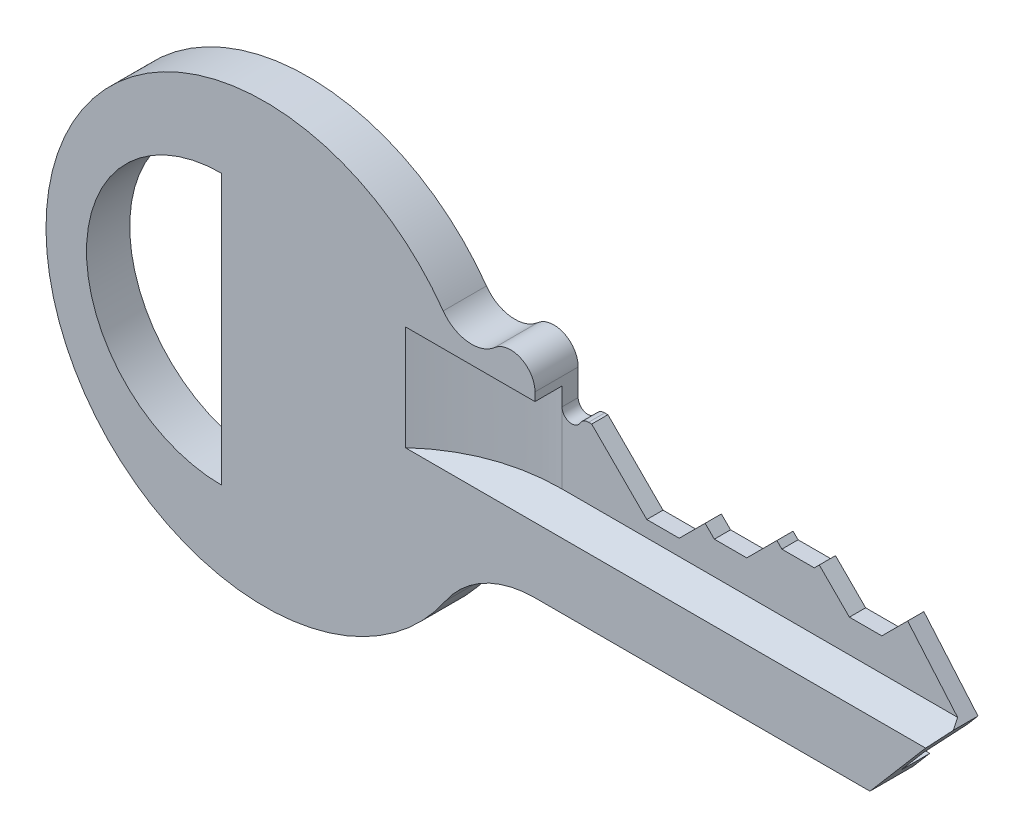
ISO-10303-21;
HEADER;
FILE_DESCRIPTION(('STEP AP214'),'2;1');
FILE_NAME('part.step','',(''),(''),'','','');
FILE_SCHEMA(('AUTOMOTIVE_DESIGN { 1 0 10303 214 1 1 1 1 }'));
ENDSEC;
DATA;
#1=APPLICATION_CONTEXT('core data for automotive mechanical design processes');
#2=APPLICATION_PROTOCOL_DEFINITION('international standard','automotive_design',2000,#1);
#3=PRODUCT_CONTEXT('',#1,'mechanical');
#4=PRODUCT('Part','Part','',(#3));
#5=PRODUCT_RELATED_PRODUCT_CATEGORY('part','',(#4));
#6=PRODUCT_DEFINITION_FORMATION('','',#4);
#7=PRODUCT_DEFINITION_CONTEXT('part definition',#1,'design');
#8=PRODUCT_DEFINITION('design','',#6,#7);
#9=PRODUCT_DEFINITION_SHAPE('','',#8);
#10=(LENGTH_UNIT() NAMED_UNIT(*) SI_UNIT(.MILLI.,.METRE.));
#11=(NAMED_UNIT(*) PLANE_ANGLE_UNIT() SI_UNIT($,.RADIAN.));
#12=(NAMED_UNIT(*) SI_UNIT($,.STERADIAN.) SOLID_ANGLE_UNIT());
#13=UNCERTAINTY_MEASURE_WITH_UNIT(LENGTH_MEASURE(1.E-05),#10,'distance_accuracy_value','');
#14=(GEOMETRIC_REPRESENTATION_CONTEXT(3) GLOBAL_UNCERTAINTY_ASSIGNED_CONTEXT((#13)) GLOBAL_UNIT_ASSIGNED_CONTEXT((#10,
#11,#12)) REPRESENTATION_CONTEXT('',''));
#15=CARTESIAN_POINT('',(0.,0.,0.));
#16=DIRECTION('',(0.,0.,1.));
#17=DIRECTION('',(1.,0.,0.));
#18=AXIS2_PLACEMENT_3D('',#15,#16,#17);
#19=CARTESIAN_POINT('',(0.,-5.07593069439131,2.032));
#20=DIRECTION('',(0.,0.,1.));
#21=DIRECTION('',(1.,0.,0.));
#22=AXIS2_PLACEMENT_3D('',#19,#20,#21);
#23=PLANE('',#22);
#24=DIRECTION('',(1.,0.,0.));
#25=VECTOR('',#24,1.);
#26=CARTESIAN_POINT('',(-6.096,3.06406515812918,2.032));
#27=LINE('',#26,#25);
#28=CARTESIAN_POINT('',(-6.096,3.06406515812918,2.032));
#29=VERTEX_POINT('',#28);
#30=CARTESIAN_POINT('',(18.3649951528505,3.06406515812918,2.032));
#31=VERTEX_POINT('',#30);
#32=EDGE_CURVE('E376',#29,#31,#27,.T.);
#33=ORIENTED_EDGE('',*,*,#32,.F.);
#34=DIRECTION('',(0.,-1.,0.));
#35=VECTOR('',#34,1.);
#36=CARTESIAN_POINT('',(-6.096,3.06406515812918,2.032));
#37=LINE('',#36,#35);
#38=CARTESIAN_POINT('',(-6.096,7.9883,2.032));
#39=VERTEX_POINT('',#38);
#40=EDGE_CURVE('E357',#39,#29,#37,.T.);
#41=ORIENTED_EDGE('',*,*,#40,.F.);
#42=DIRECTION('',(1.,0.,0.));
#43=VECTOR('',#42,1.);
#44=CARTESIAN_POINT('',(-6.096,7.9883,2.032));
#45=LINE('',#44,#43);
#46=CARTESIAN_POINT('',(0.,7.9883,2.032));
#47=VERTEX_POINT('',#46);
#48=EDGE_CURVE('E378',#39,#47,#45,.T.);
#49=ORIENTED_EDGE('',*,*,#48,.T.);
#50=DIRECTION('',(0.,1.,0.));
#51=VECTOR('',#50,1.);
#52=CARTESIAN_POINT('',(0.,7.1374,2.032));
#53=LINE('',#52,#51);
#54=CARTESIAN_POINT('',(0.,8.382,2.032));
#55=VERTEX_POINT('',#54);
#56=EDGE_CURVE('E422',#47,#55,#53,.T.);
#57=ORIENTED_EDGE('',*,*,#56,.T.);
#58=CARTESIAN_POINT('',(-1.143,8.382,2.032));
#59=DIRECTION('',(0.,0.,1.));
#60=DIRECTION('',(1.,0.,0.));
#61=AXIS2_PLACEMENT_3D('',#58,#59,#60);
#62=CIRCLE('',#61,1.143);
#63=CARTESIAN_POINT('',(-1.89643562918692,9.24152530659179,2.032));
#64=VERTEX_POINT('',#63);
#65=EDGE_CURVE('E424',#55,#64,#62,.T.);
#66=ORIENTED_EDGE('',*,*,#65,.T.);
#67=CARTESIAN_POINT('',(-2.97668145103572,10.4738782578599,2.032));
#68=DIRECTION('',(0.,0.,-1.));
#69=DIRECTION('',(-1.,0.,0.));
#70=AXIS2_PLACEMENT_3D('',#67,#68,#69);
#71=CIRCLE('',#70,1.63878761043677);
#72=CARTESIAN_POINT('',(-4.31281575711493,9.525,2.032));
#73=VERTEX_POINT('',#72);
#74=EDGE_CURVE('E426',#64,#73,#71,.T.);
#75=ORIENTED_EDGE('',*,*,#74,.T.);
#76=CARTESIAN_POINT('',(-12.6999999942675,3.5687,2.032));
#77=DIRECTION('',(0.,0.,1.));
#78=DIRECTION('',(1.,0.,0.));
#79=AXIS2_PLACEMENT_3D('',#76,#77,#78);
#80=CIRCLE('',#79,10.2870000057325);
#81=CARTESIAN_POINT('',(-4.19609520136365,-2.21973436441734,2.032));
#82=VERTEX_POINT('',#81);
#83=EDGE_CURVE('E428',#73,#82,#80,.T.);
#84=ORIENTED_EDGE('',*,*,#83,.T.);
#85=CARTESIAN_POINT('',(0.,-5.07593069439131,2.032));
#86=DIRECTION('',(0.,0.,-1.));
#87=DIRECTION('',(1.,0.,0.));
#88=AXIS2_PLACEMENT_3D('',#85,#86,#87);
#89=CIRCLE('',#88,5.07593069439131);
#90=CARTESIAN_POINT('',(0.,0.,2.032));
#91=VERTEX_POINT('',#90);
#92=EDGE_CURVE('E413',#82,#91,#89,.T.);
#93=ORIENTED_EDGE('',*,*,#92,.T.);
#94=DIRECTION('',(1.,0.,0.));
#95=VECTOR('',#94,1.);
#96=CARTESIAN_POINT('',(0.,0.,2.032));
#97=LINE('',#96,#95);
#98=CARTESIAN_POINT('',(15.748,0.,2.032));
#99=VERTEX_POINT('',#98);
#100=EDGE_CURVE('E416',#91,#99,#97,.T.);
#101=ORIENTED_EDGE('',*,*,#100,.T.);
#102=DIRECTION('',(0.649453254633193,0.760401518966363,0.));
#103=VECTOR('',#102,1.);
#104=CARTESIAN_POINT('',(15.748,0.,2.032));
#105=LINE('',#104,#103);
#106=EDGE_CURVE('E419',#99,#31,#105,.T.);
#107=ORIENTED_EDGE('',*,*,#106,.T.);
#108=EDGE_LOOP('',(#33,#41,#49,#57,#66,#75,#84,#93,#101,#107));
#109=FACE_BOUND('',#108,.T.);
#110=DIRECTION('',(0.,1.,0.));
#111=VECTOR('',#110,1.);
#112=CARTESIAN_POINT('',(-14.732,9.9187,2.032));
#113=LINE('',#112,#111);
#114=CARTESIAN_POINT('',(-14.732,-2.7813,2.032));
#115=VERTEX_POINT('',#114);
#116=CARTESIAN_POINT('',(-14.732,9.9187,2.032));
#117=VERTEX_POINT('',#116);
#118=EDGE_CURVE('E399',#115,#117,#113,.T.);
#119=ORIENTED_EDGE('',*,*,#118,.F.);
#120=CARTESIAN_POINT('',(-14.732,3.5687,2.032));
#121=DIRECTION('',(0.,0.,1.));
#122=DIRECTION('',(-1.,0.,0.));
#123=AXIS2_PLACEMENT_3D('',#120,#121,#122);
#124=CIRCLE('',#123,6.35);
#125=EDGE_CURVE('E396',#117,#115,#124,.T.);
#126=ORIENTED_EDGE('',*,*,#125,.F.);
#127=EDGE_LOOP('',(#119,#126));
#128=FACE_BOUND('',#127,.T.);
#129=ADVANCED_FACE('F36',(#109,#128),#23,.T.);
#130=CARTESIAN_POINT('',(0.,-5.07593069439131,0.));
#131=DIRECTION('',(0.,0.,1.));
#132=DIRECTION('',(1.,0.,0.));
#133=AXIS2_PLACEMENT_3D('',#130,#131,#132);
#134=PLANE('',#133);
#135=DIRECTION('',(1.,0.,0.));
#136=VECTOR('',#135,1.);
#137=CARTESIAN_POINT('',(15.0368,5.334,0.));
#138=LINE('',#137,#136);
#139=CARTESIAN_POINT('',(13.5128,5.334,0.));
#140=VERTEX_POINT('',#139);
#141=CARTESIAN_POINT('',(15.0368,5.334,0.));
#142=VERTEX_POINT('',#141);
#143=EDGE_CURVE('E302',#140,#142,#138,.T.);
#144=ORIENTED_EDGE('',*,*,#143,.T.);
#145=DIRECTION('',(0.707106781186546,0.707106781186549,0.));
#146=VECTOR('',#145,1.);
#147=CARTESIAN_POINT('',(16.2511247600768,6.54832476007678,0.));
#148=LINE('',#147,#146);
#149=CARTESIAN_POINT('',(16.2511247600768,6.54832476007678,0.));
#150=VERTEX_POINT('',#149);
#151=EDGE_CURVE('E259',#142,#150,#148,.T.);
#152=ORIENTED_EDGE('',*,*,#151,.T.);
#153=DIRECTION('',(-0.649453254633193,0.760401518966363,0.));
#154=VECTOR('',#153,1.);
#155=CARTESIAN_POINT('',(18.796,3.5687,0.));
#156=LINE('',#155,#154);
#157=CARTESIAN_POINT('',(18.796,3.5687,0.));
#158=VERTEX_POINT('',#157);
#159=EDGE_CURVE('E439',#158,#150,#156,.T.);
#160=ORIENTED_EDGE('',*,*,#159,.F.);
#161=DIRECTION('',(0.649453254633193,0.760401518966363,0.));
#162=VECTOR('',#161,1.);
#163=CARTESIAN_POINT('',(15.748,0.,0.));
#164=LINE('',#163,#162);
#165=CARTESIAN_POINT('',(18.2837676419659,2.96896128080177,0.));
#166=VERTEX_POINT('',#165);
#167=EDGE_CURVE('E435',#166,#158,#164,.T.);
#168=ORIENTED_EDGE('',*,*,#167,.F.);
#169=DIRECTION('',(1.,0.,0.));
#170=VECTOR('',#169,1.);
#171=CARTESIAN_POINT('',(-6.096,2.96896128080177,0.));
#172=LINE('',#171,#170);
#173=CARTESIAN_POINT('',(-6.096,2.96896128080177,0.));
#174=VERTEX_POINT('',#173);
#175=EDGE_CURVE('E361',#174,#166,#172,.T.);
#176=ORIENTED_EDGE('',*,*,#175,.F.);
#177=DIRECTION('',(0.,1.,0.));
#178=VECTOR('',#177,1.);
#179=CARTESIAN_POINT('',(-6.096,2.96896128080177,0.));
#180=LINE('',#179,#178);
#181=CARTESIAN_POINT('',(-6.096,0.9144,0.));
#182=VERTEX_POINT('',#181);
#183=EDGE_CURVE('E358',#182,#174,#180,.T.);
#184=ORIENTED_EDGE('',*,*,#183,.F.);
#185=DIRECTION('',(1.,0.,0.));
#186=VECTOR('',#185,1.);
#187=CARTESIAN_POINT('',(-6.096,0.9144,0.));
#188=LINE('',#187,#186);
#189=CARTESIAN_POINT('',(16.5289822064057,0.9144,0.));
#190=VERTEX_POINT('',#189);
#191=EDGE_CURVE('E363',#182,#190,#188,.T.);
#192=ORIENTED_EDGE('',*,*,#191,.T.);
#193=CARTESIAN_POINT('',(15.748,0.,0.));
#194=VERTEX_POINT('',#193);
#195=EDGE_CURVE('E436',#194,#190,#164,.T.);
#196=ORIENTED_EDGE('',*,*,#195,.F.);
#197=DIRECTION('',(1.,0.,0.));
#198=VECTOR('',#197,1.);
#199=CARTESIAN_POINT('',(0.,0.,0.));
#200=LINE('',#199,#198);
#201=CARTESIAN_POINT('',(0.,0.,0.));
#202=VERTEX_POINT('',#201);
#203=EDGE_CURVE('E433',#202,#194,#200,.T.);
#204=ORIENTED_EDGE('',*,*,#203,.F.);
#205=CARTESIAN_POINT('',(0.,-5.07593069439131,0.));
#206=DIRECTION('',(0.,0.,-1.));
#207=DIRECTION('',(1.,0.,0.));
#208=AXIS2_PLACEMENT_3D('',#205,#206,#207);
#209=CIRCLE('',#208,5.07593069439131);
#210=CARTESIAN_POINT('',(-4.19609520136365,-2.21973436441734,0.));
#211=VERTEX_POINT('',#210);
#212=EDGE_CURVE('E412',#211,#202,#209,.T.);
#213=ORIENTED_EDGE('',*,*,#212,.F.);
#214=CARTESIAN_POINT('',(-12.6999999942675,3.5687,0.));
#215=DIRECTION('',(0.,0.,1.));
#216=DIRECTION('',(1.,0.,0.));
#217=AXIS2_PLACEMENT_3D('',#214,#215,#216);
#218=CIRCLE('',#217,10.2870000057325);
#219=CARTESIAN_POINT('',(-4.31281575711493,9.525,0.));
#220=VERTEX_POINT('',#219);
#221=EDGE_CURVE('E417',#220,#211,#218,.T.);
#222=ORIENTED_EDGE('',*,*,#221,.F.);
#223=CARTESIAN_POINT('',(-2.97668145103572,10.4738782578599,0.));
#224=DIRECTION('',(0.,0.,-1.));
#225=DIRECTION('',(-1.,0.,0.));
#226=AXIS2_PLACEMENT_3D('',#223,#224,#225);
#227=CIRCLE('',#226,1.63878761043677);
#228=CARTESIAN_POINT('',(-1.89643562918692,9.24152530659179,0.));
#229=VERTEX_POINT('',#228);
#230=EDGE_CURVE('E453',#229,#220,#227,.T.);
#231=ORIENTED_EDGE('',*,*,#230,.F.);
#232=CARTESIAN_POINT('',(-1.143,8.382,0.));
#233=DIRECTION('',(0.,0.,1.));
#234=DIRECTION('',(1.,0.,0.));
#235=AXIS2_PLACEMENT_3D('',#232,#233,#234);
#236=CIRCLE('',#235,1.143);
#237=CARTESIAN_POINT('',(0.,8.382,0.));
#238=VERTEX_POINT('',#237);
#239=EDGE_CURVE('E451',#238,#229,#236,.T.);
#240=ORIENTED_EDGE('',*,*,#239,.F.);
#241=DIRECTION('',(0.,1.,0.));
#242=VECTOR('',#241,1.);
#243=CARTESIAN_POINT('',(0.,7.1374,0.));
#244=LINE('',#243,#242);
#245=CARTESIAN_POINT('',(0.,7.1374,0.));
#246=VERTEX_POINT('',#245);
#247=EDGE_CURVE('E449',#246,#238,#244,.T.);
#248=ORIENTED_EDGE('',*,*,#247,.F.);
#249=CARTESIAN_POINT('',(0.457200000000001,7.1374,0.));
#250=DIRECTION('',(0.,0.,-1.));
#251=DIRECTION('',(1.,0.,0.));
#252=AXIS2_PLACEMENT_3D('',#249,#250,#251);
#253=CIRCLE('',#252,0.457200000000001);
#254=CARTESIAN_POINT('',(0.853146814610247,6.9088,0.));
#255=VERTEX_POINT('',#254);
#256=EDGE_CURVE('E446',#255,#246,#253,.T.);
#257=ORIENTED_EDGE('',*,*,#256,.F.);
#258=CARTESIAN_POINT('',(1.24909362922049,6.6802,0.));
#259=DIRECTION('',(0.,0.,1.));
#260=DIRECTION('',(-1.,0.,0.));
#261=AXIS2_PLACEMENT_3D('',#258,#259,#260);
#262=CIRCLE('',#261,0.457200000000001);
#263=CARTESIAN_POINT('',(1.24909362922049,7.1374,0.));
#264=VERTEX_POINT('',#263);
#265=EDGE_CURVE('E443',#264,#255,#262,.T.);
#266=ORIENTED_EDGE('',*,*,#265,.F.);
#267=DIRECTION('',(-1.,0.,0.));
#268=VECTOR('',#267,1.);
#269=CARTESIAN_POINT('',(15.748,7.1374,0.));
#270=LINE('',#269,#268);
#271=CARTESIAN_POINT('',(1.39700000000001,7.1374,0.));
#272=VERTEX_POINT('',#271);
#273=EDGE_CURVE('E274',#272,#264,#270,.T.);
#274=ORIENTED_EDGE('',*,*,#273,.F.);
#275=DIRECTION('',(0.707106781186546,-0.707106781186549,0.));
#276=VECTOR('',#275,1.);
#277=CARTESIAN_POINT('',(3.9878,4.5466,0.));
#278=LINE('',#277,#276);
#279=CARTESIAN_POINT('',(3.9878,4.5466,0.));
#280=VERTEX_POINT('',#279);
#281=EDGE_CURVE('E254',#272,#280,#278,.T.);
#282=ORIENTED_EDGE('',*,*,#281,.T.);
#283=DIRECTION('',(1.,0.,0.));
#284=VECTOR('',#283,1.);
#285=CARTESIAN_POINT('',(5.5118,4.5466,0.));
#286=LINE('',#285,#284);
#287=CARTESIAN_POINT('',(5.5118,4.5466,0.));
#288=VERTEX_POINT('',#287);
#289=EDGE_CURVE('E262',#280,#288,#286,.T.);
#290=ORIENTED_EDGE('',*,*,#289,.T.);
#291=DIRECTION('',(0.707106781186546,0.707106781186549,0.));
#292=VECTOR('',#291,1.);
#293=CARTESIAN_POINT('',(6.731,5.7658,0.));
#294=LINE('',#293,#292);
#295=CARTESIAN_POINT('',(6.731,5.7658,0.));
#296=VERTEX_POINT('',#295);
#297=EDGE_CURVE('E267',#288,#296,#294,.T.);
#298=ORIENTED_EDGE('',*,*,#297,.T.);
#299=DIRECTION('',(0.707106781186546,-0.707106781186549,0.));
#300=VECTOR('',#299,1.);
#301=CARTESIAN_POINT('',(7.1628,5.334,0.));
#302=LINE('',#301,#300);
#303=CARTESIAN_POINT('',(7.1628,5.334,0.));
#304=VERTEX_POINT('',#303);
#305=EDGE_CURVE('E281',#296,#304,#302,.T.);
#306=ORIENTED_EDGE('',*,*,#305,.T.);
#307=DIRECTION('',(1.,0.,0.));
#308=VECTOR('',#307,1.);
#309=CARTESIAN_POINT('',(8.6868,5.334,0.));
#310=LINE('',#309,#308);
#311=CARTESIAN_POINT('',(8.6868,5.334,0.));
#312=VERTEX_POINT('',#311);
#313=EDGE_CURVE('E284',#304,#312,#310,.T.);
#314=ORIENTED_EDGE('',*,*,#313,.T.);
#315=DIRECTION('',(0.707106781186546,0.707106781186549,0.));
#316=VECTOR('',#315,1.);
#317=CARTESIAN_POINT('',(10.10285,6.75005,0.));
#318=LINE('',#317,#316);
#319=CARTESIAN_POINT('',(10.10285,6.75005,0.));
#320=VERTEX_POINT('',#319);
#321=EDGE_CURVE('E287',#312,#320,#318,.T.);
#322=ORIENTED_EDGE('',*,*,#321,.T.);
#323=DIRECTION('',(0.707106781186546,-0.707106781186549,0.));
#324=VECTOR('',#323,1.);
#325=CARTESIAN_POINT('',(10.3378,6.5151,0.));
#326=LINE('',#325,#324);
#327=CARTESIAN_POINT('',(10.3378,6.5151,0.));
#328=VERTEX_POINT('',#327);
#329=EDGE_CURVE('E290',#320,#328,#326,.T.);
#330=ORIENTED_EDGE('',*,*,#329,.T.);
#331=DIRECTION('',(1.,0.,0.));
#332=VECTOR('',#331,1.);
#333=CARTESIAN_POINT('',(11.8618,6.5151,0.));
#334=LINE('',#333,#332);
#335=CARTESIAN_POINT('',(11.8618,6.5151,0.));
#336=VERTEX_POINT('',#335);
#337=EDGE_CURVE('E293',#328,#336,#334,.T.);
#338=ORIENTED_EDGE('',*,*,#337,.T.);
#339=DIRECTION('',(0.707106781186545,0.70710678118655,0.));
#340=VECTOR('',#339,1.);
#341=CARTESIAN_POINT('',(12.09675,6.75005000000001,0.));
#342=LINE('',#341,#340);
#343=CARTESIAN_POINT('',(12.09675,6.75005000000001,0.));
#344=VERTEX_POINT('',#343);
#345=EDGE_CURVE('E296',#336,#344,#342,.T.);
#346=ORIENTED_EDGE('',*,*,#345,.T.);
#347=DIRECTION('',(0.707106781186546,-0.707106781186549,0.));
#348=VECTOR('',#347,1.);
#349=CARTESIAN_POINT('',(13.5128,5.334,0.));
#350=LINE('',#349,#348);
#351=EDGE_CURVE('E299',#344,#140,#350,.T.);
#352=ORIENTED_EDGE('',*,*,#351,.T.);
#353=EDGE_LOOP('',(#144,#152,#160,#168,#176,#184,#192,#196,#204,#213,#222,#231,#240,#248,#257,
#266,#274,#282,#290,#298,#306,#314,#322,#330,#338,#346,#352));
#354=FACE_BOUND('',#353,.T.);
#355=CARTESIAN_POINT('',(-14.732,3.5687,0.));
#356=DIRECTION('',(0.,0.,1.));
#357=DIRECTION('',(-1.,0.,0.));
#358=AXIS2_PLACEMENT_3D('',#355,#356,#357);
#359=CIRCLE('',#358,6.35);
#360=CARTESIAN_POINT('',(-14.732,9.9187,0.));
#361=VERTEX_POINT('',#360);
#362=CARTESIAN_POINT('',(-14.732,-2.7813,0.));
#363=VERTEX_POINT('',#362);
#364=EDGE_CURVE('E395',#361,#363,#359,.T.);
#365=ORIENTED_EDGE('',*,*,#364,.T.);
#366=DIRECTION('',(0.,1.,0.));
#367=VECTOR('',#366,1.);
#368=CARTESIAN_POINT('',(-14.732,9.9187,0.));
#369=LINE('',#368,#367);
#370=EDGE_CURVE('E400',#363,#361,#369,.T.);
#371=ORIENTED_EDGE('',*,*,#370,.T.);
#372=EDGE_LOOP('',(#365,#371));
#373=FACE_BOUND('',#372,.T.);
#374=ADVANCED_FACE('F271',(#354,#373),#134,.F.);
#375=CARTESIAN_POINT('',(0.,-5.07593069439131,2.032));
#376=DIRECTION('',(0.,0.,-1.));
#377=DIRECTION('',(-1.,0.,0.));
#378=AXIS2_PLACEMENT_3D('',#375,#376,#377);
#379=CYLINDRICAL_SURFACE('',#378,5.07593069439131);
#380=ORIENTED_EDGE('',*,*,#212,.T.);
#381=DIRECTION('',(0.,0.,-1.));
#382=VECTOR('',#381,1.);
#383=CARTESIAN_POINT('',(0.,0.,2.032));
#384=LINE('',#383,#382);
#385=EDGE_CURVE('E479',#91,#202,#384,.T.);
#386=ORIENTED_EDGE('',*,*,#385,.F.);
#387=ORIENTED_EDGE('',*,*,#92,.F.);
#388=DIRECTION('',(0.,0.,-1.));
#389=VECTOR('',#388,1.);
#390=CARTESIAN_POINT('',(-4.19609520136365,-2.21973436441734,2.032));
#391=LINE('',#390,#389);
#392=EDGE_CURVE('E430',#82,#211,#391,.T.);
#393=ORIENTED_EDGE('',*,*,#392,.T.);
#394=EDGE_LOOP('',(#380,#386,#387,#393));
#395=FACE_BOUND('',#394,.T.);
#396=ADVANCED_FACE('F545',(#395),#379,.F.);
#397=CARTESIAN_POINT('',(0.,0.,2.032));
#398=DIRECTION('',(0.,1.,0.));
#399=DIRECTION('',(0.,0.,1.));
#400=AXIS2_PLACEMENT_3D('',#397,#398,#399);
#401=PLANE('',#400);
#402=ORIENTED_EDGE('',*,*,#203,.T.);
#403=DIRECTION('',(0.,0.,-1.));
#404=VECTOR('',#403,1.);
#405=CARTESIAN_POINT('',(15.748,0.,2.032));
#406=LINE('',#405,#404);
#407=EDGE_CURVE('E476',#99,#194,#406,.T.);
#408=ORIENTED_EDGE('',*,*,#407,.F.);
#409=ORIENTED_EDGE('',*,*,#100,.F.);
#410=ORIENTED_EDGE('',*,*,#385,.T.);
#411=EDGE_LOOP('',(#402,#408,#409,#410));
#412=FACE_BOUND('',#411,.T.);
#413=ADVANCED_FACE('F548',(#412),#401,.F.);
#414=CARTESIAN_POINT('',(15.748,0.,2.032));
#415=DIRECTION('',(-0.760401518966363,0.649453254633193,0.));
#416=DIRECTION('',(-0.649453254633193,-0.760401518966363,0.));
#417=AXIS2_PLACEMENT_3D('',#414,#415,#416);
#418=PLANE('',#417);
#419=ORIENTED_EDGE('',*,*,#195,.T.);
#420=DIRECTION('',(0.,0.,1.));
#421=VECTOR('',#420,1.);
#422=CARTESIAN_POINT('',(16.5289822064057,0.9144,2.032));
#423=LINE('',#422,#421);
#424=CARTESIAN_POINT('',(16.5289822064057,0.914399999999999,1.3589));
#425=VERTEX_POINT('',#424);
#426=EDGE_CURVE('E497',#190,#425,#423,.T.);
#427=ORIENTED_EDGE('',*,*,#426,.T.);
#428=DIRECTION('',(0.649453254633193,0.760401518966363,0.));
#429=VECTOR('',#428,1.);
#430=CARTESIAN_POINT('',(15.748,0.,1.3589));
#431=LINE('',#430,#429);
#432=CARTESIAN_POINT('',(17.6136797153025,2.1844,1.3589));
#433=VERTEX_POINT('',#432);
#434=EDGE_CURVE('E494',#425,#433,#431,.T.);
#435=ORIENTED_EDGE('',*,*,#434,.T.);
#436=DIRECTION('',(0.39273399794885,0.459826055931778,-0.796442091517857));
#437=VECTOR('',#436,1.);
#438=CARTESIAN_POINT('',(16.7208990938404,1.13910268903813,3.16940805160111));
#439=LINE('',#438,#437);
#440=EDGE_CURVE('E491',#433,#166,#439,.T.);
#441=ORIENTED_EDGE('',*,*,#440,.T.);
#442=ORIENTED_EDGE('',*,*,#167,.T.);
#443=DIRECTION('',(0.,0.,-1.));
#444=VECTOR('',#443,1.);
#445=CARTESIAN_POINT('',(18.796,3.5687,2.032));
#446=LINE('',#445,#444);
#447=CARTESIAN_POINT('',(18.796,3.5687,1.15794681461025));
#448=VERTEX_POINT('',#447);
#449=EDGE_CURVE('E474',#448,#158,#446,.T.);
#450=ORIENTED_EDGE('',*,*,#449,.F.);
#451=DIRECTION('',(-0.392733997948849,-0.459826055931777,0.796442091517857));
#452=VECTOR('',#451,1.);
#453=CARTESIAN_POINT('',(17.408012378811,1.9435978268579,3.972706345983));
#454=LINE('',#453,#452);
#455=EDGE_CURVE('E392',#448,#31,#454,.T.);
#456=ORIENTED_EDGE('',*,*,#455,.T.);
#457=ORIENTED_EDGE('',*,*,#106,.F.);
#458=ORIENTED_EDGE('',*,*,#407,.T.);
#459=EDGE_LOOP('',(#419,#427,#435,#441,#442,#450,#456,#457,#458));
#460=FACE_BOUND('',#459,.T.);
#461=ADVANCED_FACE('F551',(#460),#418,.F.);
#462=CARTESIAN_POINT('',(18.796,3.5687,2.032));
#463=DIRECTION('',(-0.760401518966363,-0.649453254633193,0.));
#464=DIRECTION('',(0.649453254633193,-0.760401518966363,0.));
#465=AXIS2_PLACEMENT_3D('',#462,#463,#464);
#466=PLANE('',#465);
#467=ORIENTED_EDGE('',*,*,#449,.T.);
#468=ORIENTED_EDGE('',*,*,#159,.T.);
#469=DIRECTION('',(0.,0.,1.));
#470=VECTOR('',#469,1.);
#471=CARTESIAN_POINT('',(16.2511247600768,6.54832476007678,0.));
#472=LINE('',#471,#470);
#473=CARTESIAN_POINT('',(16.2511247600768,6.54832476007678,0.761999999999999));
#474=VERTEX_POINT('',#473);
#475=EDGE_CURVE('E334',#150,#474,#472,.T.);
#476=ORIENTED_EDGE('',*,*,#475,.T.);
#477=DIRECTION('',(0.649453254633193,-0.760401518966363,0.));
#478=VECTOR('',#477,1.);
#479=CARTESIAN_POINT('',(18.796,3.5687,0.761999999999999));
#480=LINE('',#479,#478);
#481=CARTESIAN_POINT('',(18.6007544483986,3.7973,0.762));
#482=VERTEX_POINT('',#481);
#483=EDGE_CURVE('E390',#474,#482,#480,.T.);
#484=ORIENTED_EDGE('',*,*,#483,.T.);
#485=DIRECTION('',(0.392733997948849,-0.459826055931777,0.796442091517857));
#486=VECTOR('',#485,1.);
#487=CARTESIAN_POINT('',(19.0693949968598,3.24860002451,1.71237623566048));
#488=LINE('',#487,#486);
#489=EDGE_CURVE('E488',#482,#448,#488,.T.);
#490=ORIENTED_EDGE('',*,*,#489,.T.);
#491=EDGE_LOOP('',(#467,#468,#476,#484,#490));
#492=FACE_BOUND('',#491,.T.);
#493=ADVANCED_FACE('F555',(#492),#466,.F.);
#494=CARTESIAN_POINT('',(15.748,7.1374,2.032));
#495=DIRECTION('',(0.,-1.,0.));
#496=DIRECTION('',(1.,0.,0.));
#497=AXIS2_PLACEMENT_3D('',#494,#495,#496);
#498=PLANE('',#497);
#499=DIRECTION('',(1.,0.,0.));
#500=VECTOR('',#499,1.);
#501=CARTESIAN_POINT('',(15.748,7.1374,0.762));
#502=LINE('',#501,#500);
#503=CARTESIAN_POINT('',(1.24909362922049,7.1374,0.762));
#504=VERTEX_POINT('',#503);
#505=CARTESIAN_POINT('',(1.39700000000001,7.1374,0.762));
#506=VERTEX_POINT('',#505);
#507=EDGE_CURVE('E387',#504,#506,#502,.T.);
#508=ORIENTED_EDGE('',*,*,#507,.T.);
#509=DIRECTION('',(0.,0.,-1.));
#510=VECTOR('',#509,1.);
#511=CARTESIAN_POINT('',(1.39700000000001,7.1374,2.032));
#512=LINE('',#511,#510);
#513=EDGE_CURVE('E51',#506,#272,#512,.T.);
#514=ORIENTED_EDGE('',*,*,#513,.T.);
#515=ORIENTED_EDGE('',*,*,#273,.T.);
#516=DIRECTION('',(0.,0.,-1.));
#517=VECTOR('',#516,1.);
#518=CARTESIAN_POINT('',(1.24909362922049,7.1374,2.032));
#519=LINE('',#518,#517);
#520=EDGE_CURVE('E471',#504,#264,#519,.T.);
#521=ORIENTED_EDGE('',*,*,#520,.F.);
#522=EDGE_LOOP('',(#508,#514,#515,#521));
#523=FACE_BOUND('',#522,.T.);
#524=ADVANCED_FACE('F594',(#523),#498,.F.);
#525=CARTESIAN_POINT('',(1.24909362922049,6.6802,2.032));
#526=DIRECTION('',(0.,0.,-1.));
#527=DIRECTION('',(-1.,0.,0.));
#528=AXIS2_PLACEMENT_3D('',#525,#526,#527);
#529=CYLINDRICAL_SURFACE('',#528,0.457200000000001);
#530=DIRECTION('',(0.,0.,-1.));
#531=VECTOR('',#530,1.);
#532=CARTESIAN_POINT('',(0.853146814610247,6.9088,2.032));
#533=LINE('',#532,#531);
#534=CARTESIAN_POINT('',(0.853146814610246,6.9088,0.762));
#535=VERTEX_POINT('',#534);
#536=EDGE_CURVE('E469',#535,#255,#533,.T.);
#537=ORIENTED_EDGE('',*,*,#536,.F.);
#538=CARTESIAN_POINT('',(1.24909362922049,6.6802,0.762));
#539=DIRECTION('',(0.,0.,-1.));
#540=DIRECTION('',(0.,1.,0.));
#541=AXIS2_PLACEMENT_3D('',#538,#539,#540);
#542=CIRCLE('',#541,0.457200000000001);
#543=EDGE_CURVE('E384',#535,#504,#542,.T.);
#544=ORIENTED_EDGE('',*,*,#543,.T.);
#545=ORIENTED_EDGE('',*,*,#520,.T.);
#546=ORIENTED_EDGE('',*,*,#265,.T.);
#547=EDGE_LOOP('',(#537,#544,#545,#546));
#548=FACE_BOUND('',#547,.T.);
#549=ADVANCED_FACE('F590',(#548),#529,.T.);
#550=CARTESIAN_POINT('',(0.457200000000001,7.1374,2.032));
#551=DIRECTION('',(0.,0.,-1.));
#552=DIRECTION('',(-1.,0.,0.));
#553=AXIS2_PLACEMENT_3D('',#550,#551,#552);
#554=CYLINDRICAL_SURFACE('',#553,0.457200000000001);
#555=DIRECTION('',(0.,0.,-1.));
#556=VECTOR('',#555,1.);
#557=CARTESIAN_POINT('',(0.,7.1374,2.032));
#558=LINE('',#557,#556);
#559=CARTESIAN_POINT('',(0.,7.1374,0.762));
#560=VERTEX_POINT('',#559);
#561=EDGE_CURVE('E467',#560,#246,#558,.T.);
#562=ORIENTED_EDGE('',*,*,#561,.F.);
#563=CARTESIAN_POINT('',(0.457200000000001,7.1374,0.762));
#564=DIRECTION('',(0.,0.,-1.));
#565=DIRECTION('',(0.,1.,0.));
#566=AXIS2_PLACEMENT_3D('',#563,#564,#565);
#567=CIRCLE('',#566,0.457200000000001);
#568=EDGE_CURVE('E366',#560,#535,#567,.F.);
#569=ORIENTED_EDGE('',*,*,#568,.T.);
#570=ORIENTED_EDGE('',*,*,#536,.T.);
#571=ORIENTED_EDGE('',*,*,#256,.T.);
#572=EDGE_LOOP('',(#562,#569,#570,#571));
#573=FACE_BOUND('',#572,.T.);
#574=ADVANCED_FACE('F587',(#573),#554,.F.);
#575=CARTESIAN_POINT('',(0.,7.1374,2.032));
#576=DIRECTION('',(-1.,0.,0.));
#577=DIRECTION('',(0.,-1.,0.));
#578=AXIS2_PLACEMENT_3D('',#575,#576,#577);
#579=PLANE('',#578);
#580=DIRECTION('',(0.,0.,-1.));
#581=VECTOR('',#580,1.);
#582=CARTESIAN_POINT('',(0.,7.9883,2.032));
#583=LINE('',#582,#581);
#584=CARTESIAN_POINT('',(0.,7.9883,0.762));
#585=VERTEX_POINT('',#584);
#586=EDGE_CURVE('E482',#47,#585,#583,.T.);
#587=ORIENTED_EDGE('',*,*,#586,.T.);
#588=DIRECTION('',(0.,-1.,0.));
#589=VECTOR('',#588,1.);
#590=CARTESIAN_POINT('',(0.,7.1374,0.762));
#591=LINE('',#590,#589);
#592=EDGE_CURVE('E485',#585,#560,#591,.T.);
#593=ORIENTED_EDGE('',*,*,#592,.T.);
#594=ORIENTED_EDGE('',*,*,#561,.T.);
#595=ORIENTED_EDGE('',*,*,#247,.T.);
#596=DIRECTION('',(0.,0.,-1.));
#597=VECTOR('',#596,1.);
#598=CARTESIAN_POINT('',(0.,8.382,2.032));
#599=LINE('',#598,#597);
#600=EDGE_CURVE('E464',#55,#238,#599,.T.);
#601=ORIENTED_EDGE('',*,*,#600,.F.);
#602=ORIENTED_EDGE('',*,*,#56,.F.);
#603=EDGE_LOOP('',(#587,#593,#594,#595,#601,#602));
#604=FACE_BOUND('',#603,.T.);
#605=ADVANCED_FACE('F524',(#604),#579,.F.);
#606=CARTESIAN_POINT('',(-1.143,8.382,2.032));
#607=DIRECTION('',(0.,0.,-1.));
#608=DIRECTION('',(-1.,0.,0.));
#609=AXIS2_PLACEMENT_3D('',#606,#607,#608);
#610=CYLINDRICAL_SURFACE('',#609,1.143);
#611=ORIENTED_EDGE('',*,*,#239,.T.);
#612=DIRECTION('',(0.,0.,-1.));
#613=VECTOR('',#612,1.);
#614=CARTESIAN_POINT('',(-1.89643562918692,9.24152530659179,2.032));
#615=LINE('',#614,#613);
#616=EDGE_CURVE('E461',#64,#229,#615,.T.);
#617=ORIENTED_EDGE('',*,*,#616,.F.);
#618=ORIENTED_EDGE('',*,*,#65,.F.);
#619=ORIENTED_EDGE('',*,*,#600,.T.);
#620=EDGE_LOOP('',(#611,#617,#618,#619));
#621=FACE_BOUND('',#620,.T.);
#622=ADVANCED_FACE('F530',(#621),#610,.T.);
#623=CARTESIAN_POINT('',(-2.97668145103572,10.4738782578599,2.032));
#624=DIRECTION('',(0.,0.,-1.));
#625=DIRECTION('',(-1.,0.,0.));
#626=AXIS2_PLACEMENT_3D('',#623,#624,#625);
#627=CYLINDRICAL_SURFACE('',#626,1.63878761043677);
#628=ORIENTED_EDGE('',*,*,#230,.T.);
#629=DIRECTION('',(0.,0.,-1.));
#630=VECTOR('',#629,1.);
#631=CARTESIAN_POINT('',(-4.31281575711493,9.525,2.032));
#632=LINE('',#631,#630);
#633=EDGE_CURVE('E458',#73,#220,#632,.T.);
#634=ORIENTED_EDGE('',*,*,#633,.F.);
#635=ORIENTED_EDGE('',*,*,#74,.F.);
#636=ORIENTED_EDGE('',*,*,#616,.T.);
#637=EDGE_LOOP('',(#628,#634,#635,#636));
#638=FACE_BOUND('',#637,.T.);
#639=ADVANCED_FACE('F536',(#638),#627,.F.);
#640=CARTESIAN_POINT('',(-12.6999999942675,3.5687,2.032));
#641=DIRECTION('',(0.,0.,-1.));
#642=DIRECTION('',(-1.,0.,0.));
#643=AXIS2_PLACEMENT_3D('',#640,#641,#642);
#644=CYLINDRICAL_SURFACE('',#643,10.2870000057325);
#645=ORIENTED_EDGE('',*,*,#221,.T.);
#646=ORIENTED_EDGE('',*,*,#392,.F.);
#647=ORIENTED_EDGE('',*,*,#83,.F.);
#648=ORIENTED_EDGE('',*,*,#633,.T.);
#649=EDGE_LOOP('',(#645,#646,#647,#648));
#650=FACE_BOUND('',#649,.T.);
#651=ADVANCED_FACE('F540',(#650),#644,.T.);
#652=CARTESIAN_POINT('',(-14.732,3.5687,2.032));
#653=DIRECTION('',(0.,0.,-1.));
#654=DIRECTION('',(-1.,0.,0.));
#655=AXIS2_PLACEMENT_3D('',#652,#653,#654);
#656=CYLINDRICAL_SURFACE('',#655,6.35);
#657=ORIENTED_EDGE('',*,*,#364,.F.);
#658=DIRECTION('',(0.,0.,-1.));
#659=VECTOR('',#658,1.);
#660=CARTESIAN_POINT('',(-14.732,9.9187,2.032));
#661=LINE('',#660,#659);
#662=EDGE_CURVE('E402',#117,#361,#661,.T.);
#663=ORIENTED_EDGE('',*,*,#662,.F.);
#664=ORIENTED_EDGE('',*,*,#125,.T.);
#665=DIRECTION('',(0.,0.,-1.));
#666=VECTOR('',#665,1.);
#667=CARTESIAN_POINT('',(-14.732,-2.7813,2.032));
#668=LINE('',#667,#666);
#669=EDGE_CURVE('E409',#115,#363,#668,.T.);
#670=ORIENTED_EDGE('',*,*,#669,.T.);
#671=EDGE_LOOP('',(#657,#663,#664,#670));
#672=FACE_BOUND('',#671,.T.);
#673=ADVANCED_FACE('F577',(#672),#656,.F.);
#674=CARTESIAN_POINT('',(-14.732,9.9187,2.032));
#675=DIRECTION('',(-1.,0.,0.));
#676=DIRECTION('',(0.,0.,1.));
#677=AXIS2_PLACEMENT_3D('',#674,#675,#676);
#678=PLANE('',#677);
#679=ORIENTED_EDGE('',*,*,#370,.F.);
#680=ORIENTED_EDGE('',*,*,#669,.F.);
#681=ORIENTED_EDGE('',*,*,#118,.T.);
#682=ORIENTED_EDGE('',*,*,#662,.T.);
#683=EDGE_LOOP('',(#679,#680,#681,#682));
#684=FACE_BOUND('',#683,.T.);
#685=ADVANCED_FACE('F567',(#684),#678,.T.);
#686=CARTESIAN_POINT('',(-6.096,3.7973,0.761999999999999));
#687=DIRECTION('',(0.,-0.866025403784441,-0.499999999999995));
#688=DIRECTION('',(0.,0.499999999999995,-0.866025403784441));
#689=AXIS2_PLACEMENT_3D('',#686,#687,#688);
#690=PLANE('',#689);
#691=DIRECTION('',(1.,0.,0.));
#692=VECTOR('',#691,1.);
#693=CARTESIAN_POINT('',(-6.096,3.7973,0.761999999999999));
#694=LINE('',#693,#692);
#695=CARTESIAN_POINT('',(-0.00529396539283508,3.7973,0.761999999999999));
#696=VERTEX_POINT('',#695);
#697=EDGE_CURVE('E362',#696,#482,#694,.T.);
#698=ORIENTED_EDGE('',*,*,#697,.F.);
#699=CARTESIAN_POINT('',(-0.00529396539283508,-5.00151810244978,16.002));
#700=DIRECTION('',(0.,-0.866025403784441,-0.499999999999995));
#701=DIRECTION('',(0.,-0.499999999999995,0.866025403784441));
#702=AXIS2_PLACEMENT_3D('',#699,#700,#701);
#703=ELLIPSE('',#702,17.5976362048997,15.24);
#704=EDGE_CURVE('E44',#696,#29,#703,.F.);
#705=ORIENTED_EDGE('',*,*,#704,.T.);
#706=ORIENTED_EDGE('',*,*,#32,.T.);
#707=ORIENTED_EDGE('',*,*,#455,.F.);
#708=ORIENTED_EDGE('',*,*,#489,.F.);
#709=EDGE_LOOP('',(#698,#705,#706,#707,#708));
#710=FACE_BOUND('',#709,.T.);
#711=ADVANCED_FACE('F511',(#710),#690,.F.);
#712=CARTESIAN_POINT('',(-6.096,7.9883,0.762));
#713=DIRECTION('',(0.,0.,-1.));
#714=DIRECTION('',(0.,1.,0.));
#715=AXIS2_PLACEMENT_3D('',#712,#713,#714);
#716=PLANE('',#715);
#717=ORIENTED_EDGE('',*,*,#483,.F.);
#718=DIRECTION('',(0.707106781186546,0.707106781186549,0.));
#719=VECTOR('',#718,1.);
#720=CARTESIAN_POINT('',(16.2511247600768,6.54832476007678,0.761999999999999));
#721=LINE('',#720,#719);
#722=CARTESIAN_POINT('',(15.0368,5.334,0.761999999999999));
#723=VERTEX_POINT('',#722);
#724=EDGE_CURVE('E275',#723,#474,#721,.T.);
#725=ORIENTED_EDGE('',*,*,#724,.F.);
#726=DIRECTION('',(1.,0.,0.));
#727=VECTOR('',#726,1.);
#728=CARTESIAN_POINT('',(15.0368,5.334,0.761999999999999));
#729=LINE('',#728,#727);
#730=CARTESIAN_POINT('',(13.5128,5.334,0.761999999999999));
#731=VERTEX_POINT('',#730);
#732=EDGE_CURVE('E277',#731,#723,#729,.T.);
#733=ORIENTED_EDGE('',*,*,#732,.F.);
#734=DIRECTION('',(0.707106781186546,-0.707106781186549,0.));
#735=VECTOR('',#734,1.);
#736=CARTESIAN_POINT('',(13.5128,5.334,0.761999999999999));
#737=LINE('',#736,#735);
#738=CARTESIAN_POINT('',(12.09675,6.75005000000001,0.761999999999999));
#739=VERTEX_POINT('',#738);
#740=EDGE_CURVE('E329',#739,#731,#737,.T.);
#741=ORIENTED_EDGE('',*,*,#740,.F.);
#742=DIRECTION('',(0.707106781186545,0.70710678118655,0.));
#743=VECTOR('',#742,1.);
#744=CARTESIAN_POINT('',(12.09675,6.75005000000001,0.761999999999999));
#745=LINE('',#744,#743);
#746=CARTESIAN_POINT('',(11.8618,6.5151,0.761999999999999));
#747=VERTEX_POINT('',#746);
#748=EDGE_CURVE('E326',#747,#739,#745,.T.);
#749=ORIENTED_EDGE('',*,*,#748,.F.);
#750=DIRECTION('',(1.,0.,0.));
#751=VECTOR('',#750,1.);
#752=CARTESIAN_POINT('',(11.8618,6.5151,0.761999999999999));
#753=LINE('',#752,#751);
#754=CARTESIAN_POINT('',(10.3378,6.5151,0.761999999999999));
#755=VERTEX_POINT('',#754);
#756=EDGE_CURVE('E323',#755,#747,#753,.T.);
#757=ORIENTED_EDGE('',*,*,#756,.F.);
#758=DIRECTION('',(0.707106781186546,-0.707106781186549,0.));
#759=VECTOR('',#758,1.);
#760=CARTESIAN_POINT('',(10.3378,6.5151,0.761999999999999));
#761=LINE('',#760,#759);
#762=CARTESIAN_POINT('',(10.10285,6.75005,0.761999999999999));
#763=VERTEX_POINT('',#762);
#764=EDGE_CURVE('E320',#763,#755,#761,.T.);
#765=ORIENTED_EDGE('',*,*,#764,.F.);
#766=DIRECTION('',(0.707106781186546,0.707106781186549,0.));
#767=VECTOR('',#766,1.);
#768=CARTESIAN_POINT('',(10.10285,6.75005,0.761999999999999));
#769=LINE('',#768,#767);
#770=CARTESIAN_POINT('',(8.6868,5.334,0.761999999999999));
#771=VERTEX_POINT('',#770);
#772=EDGE_CURVE('E317',#771,#763,#769,.T.);
#773=ORIENTED_EDGE('',*,*,#772,.F.);
#774=DIRECTION('',(1.,0.,0.));
#775=VECTOR('',#774,1.);
#776=CARTESIAN_POINT('',(8.6868,5.334,0.761999999999999));
#777=LINE('',#776,#775);
#778=CARTESIAN_POINT('',(7.1628,5.334,0.761999999999999));
#779=VERTEX_POINT('',#778);
#780=EDGE_CURVE('E314',#779,#771,#777,.T.);
#781=ORIENTED_EDGE('',*,*,#780,.F.);
#782=DIRECTION('',(0.707106781186546,-0.707106781186549,0.));
#783=VECTOR('',#782,1.);
#784=CARTESIAN_POINT('',(7.1628,5.334,0.761999999999999));
#785=LINE('',#784,#783);
#786=CARTESIAN_POINT('',(6.731,5.7658,0.761999999999999));
#787=VERTEX_POINT('',#786);
#788=EDGE_CURVE('E311',#787,#779,#785,.T.);
#789=ORIENTED_EDGE('',*,*,#788,.F.);
#790=DIRECTION('',(0.707106781186546,0.707106781186549,0.));
#791=VECTOR('',#790,1.);
#792=CARTESIAN_POINT('',(6.731,5.7658,0.761999999999999));
#793=LINE('',#792,#791);
#794=CARTESIAN_POINT('',(5.5118,4.5466,0.761999999999999));
#795=VERTEX_POINT('',#794);
#796=EDGE_CURVE('E308',#795,#787,#793,.T.);
#797=ORIENTED_EDGE('',*,*,#796,.F.);
#798=DIRECTION('',(1.,0.,0.));
#799=VECTOR('',#798,1.);
#800=CARTESIAN_POINT('',(5.5118,4.5466,0.761999999999999));
#801=LINE('',#800,#799);
#802=CARTESIAN_POINT('',(3.9878,4.5466,0.761999999999999));
#803=VERTEX_POINT('',#802);
#804=EDGE_CURVE('E306',#803,#795,#801,.T.);
#805=ORIENTED_EDGE('',*,*,#804,.F.);
#806=DIRECTION('',(-0.707106781186546,0.707106781186549,0.));
#807=VECTOR('',#806,1.);
#808=CARTESIAN_POINT('',(-2.77494999999998,11.30935,0.762000000000001));
#809=LINE('',#808,#807);
#810=EDGE_CURVE('E11',#803,#506,#809,.T.);
#811=ORIENTED_EDGE('',*,*,#810,.T.);
#812=ORIENTED_EDGE('',*,*,#507,.F.);
#813=ORIENTED_EDGE('',*,*,#543,.F.);
#814=ORIENTED_EDGE('',*,*,#568,.F.);
#815=ORIENTED_EDGE('',*,*,#592,.F.);
#816=DIRECTION('',(1.,0.,0.));
#817=VECTOR('',#816,1.);
#818=CARTESIAN_POINT('',(-6.096,7.9883,0.762));
#819=LINE('',#818,#817);
#820=CARTESIAN_POINT('',(-0.00529396539283508,7.9883,0.762));
#821=VERTEX_POINT('',#820);
#822=EDGE_CURVE('E374',#821,#585,#819,.T.);
#823=ORIENTED_EDGE('',*,*,#822,.F.);
#824=DIRECTION('',(0.,-1.,0.));
#825=VECTOR('',#824,1.);
#826=CARTESIAN_POINT('',(-0.00529396539283508,7.9883,0.762));
#827=LINE('',#826,#825);
#828=EDGE_CURVE('E58',#821,#696,#827,.T.);
#829=ORIENTED_EDGE('',*,*,#828,.T.);
#830=ORIENTED_EDGE('',*,*,#697,.T.);
#831=EDGE_LOOP('',(#717,#725,#733,#741,#749,#757,#765,#773,#781,#789,#797,#805,#811,#812,#813,
#814,#815,#823,#829,#830));
#832=FACE_BOUND('',#831,.T.);
#833=ADVANCED_FACE('F558',(#832),#716,.F.);
#834=CARTESIAN_POINT('',(-6.096,7.9883,2.032));
#835=DIRECTION('',(0.,1.,0.));
#836=DIRECTION('',(0.,0.,1.));
#837=AXIS2_PLACEMENT_3D('',#834,#835,#836);
#838=PLANE('',#837);
#839=ORIENTED_EDGE('',*,*,#48,.F.);
#840=CARTESIAN_POINT('',(-0.00529396539283508,7.9883,16.002));
#841=DIRECTION('',(0.,1.,0.));
#842=DIRECTION('',(0.,0.,1.));
#843=AXIS2_PLACEMENT_3D('',#840,#841,#842);
#844=CIRCLE('',#843,15.24);
#845=EDGE_CURVE('E506',#39,#821,#844,.F.);
#846=ORIENTED_EDGE('',*,*,#845,.T.);
#847=ORIENTED_EDGE('',*,*,#822,.T.);
#848=ORIENTED_EDGE('',*,*,#586,.F.);
#849=EDGE_LOOP('',(#839,#846,#847,#848));
#850=FACE_BOUND('',#849,.T.);
#851=ADVANCED_FACE('F520',(#850),#838,.F.);
#852=CARTESIAN_POINT('',(-6.096,0.9144,0.));
#853=DIRECTION('',(0.,-1.,0.));
#854=DIRECTION('',(0.,0.,-1.));
#855=AXIS2_PLACEMENT_3D('',#852,#853,#854);
#856=PLANE('',#855);
#857=ORIENTED_EDGE('',*,*,#191,.F.);
#858=CARTESIAN_POINT('',(0.19468063010673,0.914400000000002,-13.8811));
#859=DIRECTION('',(0.,-1.,0.));
#860=DIRECTION('',(0.,0.,-1.));
#861=AXIS2_PLACEMENT_3D('',#858,#859,#860);
#862=CIRCLE('',#861,15.24);
#863=CARTESIAN_POINT('',(0.19468063010673,0.9144,1.3589));
#864=VERTEX_POINT('',#863);
#865=EDGE_CURVE('E500',#182,#864,#862,.F.);
#866=ORIENTED_EDGE('',*,*,#865,.T.);
#867=DIRECTION('',(1.,0.,0.));
#868=VECTOR('',#867,1.);
#869=CARTESIAN_POINT('',(-6.096,0.9144,1.3589));
#870=LINE('',#869,#868);
#871=EDGE_CURVE('E367',#864,#425,#870,.T.);
#872=ORIENTED_EDGE('',*,*,#871,.T.);
#873=ORIENTED_EDGE('',*,*,#426,.F.);
#874=EDGE_LOOP('',(#857,#866,#872,#873));
#875=FACE_BOUND('',#874,.T.);
#876=ADVANCED_FACE('F565',(#875),#856,.F.);
#877=CARTESIAN_POINT('',(-6.096,0.9144,1.3589));
#878=DIRECTION('',(0.,0.,1.));
#879=DIRECTION('',(0.,-1.,0.));
#880=AXIS2_PLACEMENT_3D('',#877,#878,#879);
#881=PLANE('',#880);
#882=ORIENTED_EDGE('',*,*,#871,.F.);
#883=DIRECTION('',(0.,1.,0.));
#884=VECTOR('',#883,1.);
#885=CARTESIAN_POINT('',(0.19468063010673,0.9144,1.3589));
#886=LINE('',#885,#884);
#887=CARTESIAN_POINT('',(0.19468063010673,2.1844,1.3589));
#888=VERTEX_POINT('',#887);
#889=EDGE_CURVE('E502',#864,#888,#886,.T.);
#890=ORIENTED_EDGE('',*,*,#889,.T.);
#891=DIRECTION('',(1.,0.,0.));
#892=VECTOR('',#891,1.);
#893=CARTESIAN_POINT('',(-6.096,2.1844,1.3589));
#894=LINE('',#893,#892);
#895=EDGE_CURVE('E369',#888,#433,#894,.T.);
#896=ORIENTED_EDGE('',*,*,#895,.T.);
#897=ORIENTED_EDGE('',*,*,#434,.F.);
#898=EDGE_LOOP('',(#882,#890,#896,#897));
#899=FACE_BOUND('',#898,.T.);
#900=ADVANCED_FACE('F614',(#899),#881,.F.);
#901=CARTESIAN_POINT('',(-6.096,2.1844,1.3589));
#902=DIRECTION('',(0.,0.866025403784441,0.499999999999995));
#903=DIRECTION('',(0.,-0.499999999999995,0.866025403784441));
#904=AXIS2_PLACEMENT_3D('',#901,#902,#903);
#905=PLANE('',#904);
#906=ORIENTED_EDGE('',*,*,#895,.F.);
#907=CARTESIAN_POINT('',(0.19468063010673,10.9832181024498,-13.8811));
#908=DIRECTION('',(0.,0.866025403784441,0.499999999999995));
#909=DIRECTION('',(0.,0.499999999999995,-0.866025403784441));
#910=AXIS2_PLACEMENT_3D('',#907,#908,#909);
#911=ELLIPSE('',#910,17.5976362048997,15.24);
#912=EDGE_CURVE('E504',#888,#174,#911,.F.);
#913=ORIENTED_EDGE('',*,*,#912,.T.);
#914=ORIENTED_EDGE('',*,*,#175,.T.);
#915=ORIENTED_EDGE('',*,*,#440,.F.);
#916=EDGE_LOOP('',(#906,#913,#914,#915));
#917=FACE_BOUND('',#916,.T.);
#918=ADVANCED_FACE('F608',(#917),#905,.F.);
#919=CARTESIAN_POINT('',(0.19468063010673,0.,-13.8811));
#920=DIRECTION('',(0.,1.,0.));
#921=DIRECTION('',(0.,0.,1.));
#922=AXIS2_PLACEMENT_3D('',#919,#920,#921);
#923=CYLINDRICAL_SURFACE('',#922,15.24);
#924=ORIENTED_EDGE('',*,*,#912,.F.);
#925=ORIENTED_EDGE('',*,*,#889,.F.);
#926=ORIENTED_EDGE('',*,*,#865,.F.);
#927=ORIENTED_EDGE('',*,*,#183,.T.);
#928=EDGE_LOOP('',(#924,#925,#926,#927));
#929=FACE_BOUND('',#928,.T.);
#930=ADVANCED_FACE('F606',(#929),#923,.F.);
#931=CARTESIAN_POINT('',(-0.00529396539283508,0.,16.002));
#932=DIRECTION('',(0.,-1.,0.));
#933=DIRECTION('',(0.,0.,-1.));
#934=AXIS2_PLACEMENT_3D('',#931,#932,#933);
#935=CYLINDRICAL_SURFACE('',#934,15.24);
#936=ORIENTED_EDGE('',*,*,#704,.F.);
#937=ORIENTED_EDGE('',*,*,#828,.F.);
#938=ORIENTED_EDGE('',*,*,#845,.F.);
#939=ORIENTED_EDGE('',*,*,#40,.T.);
#940=EDGE_LOOP('',(#936,#937,#938,#939));
#941=FACE_BOUND('',#940,.T.);
#942=ADVANCED_FACE('F38',(#941),#935,.F.);
#943=CARTESIAN_POINT('',(3.9878,4.5466,0.));
#944=DIRECTION('',(-0.707106781186549,-0.707106781186546,0.));
#945=DIRECTION('',(0.707106781186546,-0.707106781186549,0.));
#946=AXIS2_PLACEMENT_3D('',#943,#944,#945);
#947=PLANE('',#946);
#948=ORIENTED_EDGE('',*,*,#810,.F.);
#949=DIRECTION('',(0.,0.,1.));
#950=VECTOR('',#949,1.);
#951=CARTESIAN_POINT('',(3.9878,4.5466,0.));
#952=LINE('',#951,#950);
#953=EDGE_CURVE('E250',#280,#803,#952,.T.);
#954=ORIENTED_EDGE('',*,*,#953,.F.);
#955=ORIENTED_EDGE('',*,*,#281,.F.);
#956=ORIENTED_EDGE('',*,*,#513,.F.);
#957=EDGE_LOOP('',(#948,#954,#955,#956));
#958=FACE_BOUND('',#957,.T.);
#959=ADVANCED_FACE('F252',(#958),#947,.F.);
#960=CARTESIAN_POINT('',(16.2511247600768,6.54832476007678,0.));
#961=DIRECTION('',(0.707106781186549,-0.707106781186546,0.));
#962=DIRECTION('',(0.707106781186546,0.707106781186549,0.));
#963=AXIS2_PLACEMENT_3D('',#960,#961,#962);
#964=PLANE('',#963);
#965=ORIENTED_EDGE('',*,*,#724,.T.);
#966=ORIENTED_EDGE('',*,*,#475,.F.);
#967=ORIENTED_EDGE('',*,*,#151,.F.);
#968=DIRECTION('',(0.,0.,1.));
#969=VECTOR('',#968,1.);
#970=CARTESIAN_POINT('',(15.0368,5.334,0.));
#971=LINE('',#970,#969);
#972=EDGE_CURVE('E337',#142,#723,#971,.T.);
#973=ORIENTED_EDGE('',*,*,#972,.T.);
#974=EDGE_LOOP('',(#965,#966,#967,#973));
#975=FACE_BOUND('',#974,.T.);
#976=ADVANCED_FACE('F671',(#975),#964,.F.);
#977=CARTESIAN_POINT('',(15.0368,5.334,0.));
#978=DIRECTION('',(0.,-1.,0.));
#979=DIRECTION('',(1.,0.,0.));
#980=AXIS2_PLACEMENT_3D('',#977,#978,#979);
#981=PLANE('',#980);
#982=ORIENTED_EDGE('',*,*,#732,.T.);
#983=ORIENTED_EDGE('',*,*,#972,.F.);
#984=ORIENTED_EDGE('',*,*,#143,.F.);
#985=DIRECTION('',(0.,0.,1.));
#986=VECTOR('',#985,1.);
#987=CARTESIAN_POINT('',(13.5128,5.334,0.));
#988=LINE('',#987,#986);
#989=EDGE_CURVE('E339',#140,#731,#988,.T.);
#990=ORIENTED_EDGE('',*,*,#989,.T.);
#991=EDGE_LOOP('',(#982,#983,#984,#990));
#992=FACE_BOUND('',#991,.T.);
#993=ADVANCED_FACE('F668',(#992),#981,.F.);
#994=CARTESIAN_POINT('',(13.5128,5.334,0.));
#995=DIRECTION('',(-0.707106781186549,-0.707106781186546,0.));
#996=DIRECTION('',(0.707106781186546,-0.707106781186549,0.));
#997=AXIS2_PLACEMENT_3D('',#994,#995,#996);
#998=PLANE('',#997);
#999=ORIENTED_EDGE('',*,*,#740,.T.);
#1000=ORIENTED_EDGE('',*,*,#989,.F.);
#1001=ORIENTED_EDGE('',*,*,#351,.F.);
#1002=DIRECTION('',(0.,0.,1.));
#1003=VECTOR('',#1002,1.);
#1004=CARTESIAN_POINT('',(12.09675,6.75005000000001,0.));
#1005=LINE('',#1004,#1003);
#1006=EDGE_CURVE('E341',#344,#739,#1005,.T.);
#1007=ORIENTED_EDGE('',*,*,#1006,.T.);
#1008=EDGE_LOOP('',(#999,#1000,#1001,#1007));
#1009=FACE_BOUND('',#1008,.T.);
#1010=ADVANCED_FACE('F664',(#1009),#998,.F.);
#1011=CARTESIAN_POINT('',(12.09675,6.75005000000001,0.));
#1012=DIRECTION('',(0.70710678118655,-0.707106781186545,0.));
#1013=DIRECTION('',(0.707106781186545,0.70710678118655,0.));
#1014=AXIS2_PLACEMENT_3D('',#1011,#1012,#1013);
#1015=PLANE('',#1014);
#1016=ORIENTED_EDGE('',*,*,#748,.T.);
#1017=ORIENTED_EDGE('',*,*,#1006,.F.);
#1018=ORIENTED_EDGE('',*,*,#345,.F.);
#1019=DIRECTION('',(0.,0.,1.));
#1020=VECTOR('',#1019,1.);
#1021=CARTESIAN_POINT('',(11.8618,6.5151,0.));
#1022=LINE('',#1021,#1020);
#1023=EDGE_CURVE('E343',#336,#747,#1022,.T.);
#1024=ORIENTED_EDGE('',*,*,#1023,.T.);
#1025=EDGE_LOOP('',(#1016,#1017,#1018,#1024));
#1026=FACE_BOUND('',#1025,.T.);
#1027=ADVANCED_FACE('F660',(#1026),#1015,.F.);
#1028=CARTESIAN_POINT('',(11.8618,6.5151,0.));
#1029=DIRECTION('',(0.,-1.,0.));
#1030=DIRECTION('',(1.,0.,0.));
#1031=AXIS2_PLACEMENT_3D('',#1028,#1029,#1030);
#1032=PLANE('',#1031);
#1033=ORIENTED_EDGE('',*,*,#756,.T.);
#1034=ORIENTED_EDGE('',*,*,#1023,.F.);
#1035=ORIENTED_EDGE('',*,*,#337,.F.);
#1036=DIRECTION('',(0.,0.,1.));
#1037=VECTOR('',#1036,1.);
#1038=CARTESIAN_POINT('',(10.3378,6.5151,0.));
#1039=LINE('',#1038,#1037);
#1040=EDGE_CURVE('E345',#328,#755,#1039,.T.);
#1041=ORIENTED_EDGE('',*,*,#1040,.T.);
#1042=EDGE_LOOP('',(#1033,#1034,#1035,#1041));
#1043=FACE_BOUND('',#1042,.T.);
#1044=ADVANCED_FACE('F656',(#1043),#1032,.F.);
#1045=CARTESIAN_POINT('',(10.3378,6.5151,0.));
#1046=DIRECTION('',(-0.707106781186549,-0.707106781186546,0.));
#1047=DIRECTION('',(0.707106781186546,-0.707106781186549,0.));
#1048=AXIS2_PLACEMENT_3D('',#1045,#1046,#1047);
#1049=PLANE('',#1048);
#1050=ORIENTED_EDGE('',*,*,#764,.T.);
#1051=ORIENTED_EDGE('',*,*,#1040,.F.);
#1052=ORIENTED_EDGE('',*,*,#329,.F.);
#1053=DIRECTION('',(0.,0.,1.));
#1054=VECTOR('',#1053,1.);
#1055=CARTESIAN_POINT('',(10.10285,6.75005,0.));
#1056=LINE('',#1055,#1054);
#1057=EDGE_CURVE('E347',#320,#763,#1056,.T.);
#1058=ORIENTED_EDGE('',*,*,#1057,.T.);
#1059=EDGE_LOOP('',(#1050,#1051,#1052,#1058));
#1060=FACE_BOUND('',#1059,.T.);
#1061=ADVANCED_FACE('F652',(#1060),#1049,.F.);
#1062=CARTESIAN_POINT('',(10.10285,6.75005,0.));
#1063=DIRECTION('',(0.707106781186549,-0.707106781186546,0.));
#1064=DIRECTION('',(0.707106781186546,0.707106781186549,0.));
#1065=AXIS2_PLACEMENT_3D('',#1062,#1063,#1064);
#1066=PLANE('',#1065);
#1067=ORIENTED_EDGE('',*,*,#772,.T.);
#1068=ORIENTED_EDGE('',*,*,#1057,.F.);
#1069=ORIENTED_EDGE('',*,*,#321,.F.);
#1070=DIRECTION('',(0.,0.,1.));
#1071=VECTOR('',#1070,1.);
#1072=CARTESIAN_POINT('',(8.6868,5.334,0.));
#1073=LINE('',#1072,#1071);
#1074=EDGE_CURVE('E349',#312,#771,#1073,.T.);
#1075=ORIENTED_EDGE('',*,*,#1074,.T.);
#1076=EDGE_LOOP('',(#1067,#1068,#1069,#1075));
#1077=FACE_BOUND('',#1076,.T.);
#1078=ADVANCED_FACE('F648',(#1077),#1066,.F.);
#1079=CARTESIAN_POINT('',(8.6868,5.334,0.));
#1080=DIRECTION('',(0.,-1.,0.));
#1081=DIRECTION('',(1.,0.,0.));
#1082=AXIS2_PLACEMENT_3D('',#1079,#1080,#1081);
#1083=PLANE('',#1082);
#1084=ORIENTED_EDGE('',*,*,#780,.T.);
#1085=ORIENTED_EDGE('',*,*,#1074,.F.);
#1086=ORIENTED_EDGE('',*,*,#313,.F.);
#1087=DIRECTION('',(0.,0.,1.));
#1088=VECTOR('',#1087,1.);
#1089=CARTESIAN_POINT('',(7.1628,5.334,0.));
#1090=LINE('',#1089,#1088);
#1091=EDGE_CURVE('E351',#304,#779,#1090,.T.);
#1092=ORIENTED_EDGE('',*,*,#1091,.T.);
#1093=EDGE_LOOP('',(#1084,#1085,#1086,#1092));
#1094=FACE_BOUND('',#1093,.T.);
#1095=ADVANCED_FACE('F644',(#1094),#1083,.F.);
#1096=CARTESIAN_POINT('',(7.1628,5.334,0.));
#1097=DIRECTION('',(-0.707106781186549,-0.707106781186546,0.));
#1098=DIRECTION('',(0.707106781186546,-0.707106781186549,0.));
#1099=AXIS2_PLACEMENT_3D('',#1096,#1097,#1098);
#1100=PLANE('',#1099);
#1101=ORIENTED_EDGE('',*,*,#788,.T.);
#1102=ORIENTED_EDGE('',*,*,#1091,.F.);
#1103=ORIENTED_EDGE('',*,*,#305,.F.);
#1104=DIRECTION('',(0.,0.,1.));
#1105=VECTOR('',#1104,1.);
#1106=CARTESIAN_POINT('',(6.731,5.7658,0.));
#1107=LINE('',#1106,#1105);
#1108=EDGE_CURVE('E353',#296,#787,#1107,.T.);
#1109=ORIENTED_EDGE('',*,*,#1108,.T.);
#1110=EDGE_LOOP('',(#1101,#1102,#1103,#1109));
#1111=FACE_BOUND('',#1110,.T.);
#1112=ADVANCED_FACE('F642',(#1111),#1100,.F.);
#1113=CARTESIAN_POINT('',(6.731,5.7658,0.));
#1114=DIRECTION('',(0.707106781186549,-0.707106781186546,0.));
#1115=DIRECTION('',(0.707106781186546,0.707106781186549,0.));
#1116=AXIS2_PLACEMENT_3D('',#1113,#1114,#1115);
#1117=PLANE('',#1116);
#1118=ORIENTED_EDGE('',*,*,#796,.T.);
#1119=ORIENTED_EDGE('',*,*,#1108,.F.);
#1120=ORIENTED_EDGE('',*,*,#297,.F.);
#1121=DIRECTION('',(0.,0.,1.));
#1122=VECTOR('',#1121,1.);
#1123=CARTESIAN_POINT('',(5.5118,4.5466,0.));
#1124=LINE('',#1123,#1122);
#1125=EDGE_CURVE('E258',#288,#795,#1124,.T.);
#1126=ORIENTED_EDGE('',*,*,#1125,.T.);
#1127=EDGE_LOOP('',(#1118,#1119,#1120,#1126));
#1128=FACE_BOUND('',#1127,.T.);
#1129=ADVANCED_FACE('F638',(#1128),#1117,.F.);
#1130=CARTESIAN_POINT('',(5.5118,4.5466,0.));
#1131=DIRECTION('',(0.,-1.,0.));
#1132=DIRECTION('',(1.,0.,0.));
#1133=AXIS2_PLACEMENT_3D('',#1130,#1131,#1132);
#1134=PLANE('',#1133);
#1135=ORIENTED_EDGE('',*,*,#804,.T.);
#1136=ORIENTED_EDGE('',*,*,#1125,.F.);
#1137=ORIENTED_EDGE('',*,*,#289,.F.);
#1138=ORIENTED_EDGE('',*,*,#953,.T.);
#1139=EDGE_LOOP('',(#1135,#1136,#1137,#1138));
#1140=FACE_BOUND('',#1139,.T.);
#1141=ADVANCED_FACE('F263',(#1140),#1134,.F.);
#1142=CLOSED_SHELL('',(#129,#374,#396,#413,#461,#493,#524,#549,#574,#605,#622,#639,#651,#673,
#685,#711,#833,#851,#876,#900,#918,#930,#942,#959,#976,#993,#1010,#1027,#1044,#1061,#1078,#1095,
#1112,#1129,#1141));
#1143=MANIFOLD_SOLID_BREP('B2',#1142);
#1144=ADVANCED_BREP_SHAPE_REPRESENTATION('',(#18,#1143),#14);
#1145=SHAPE_DEFINITION_REPRESENTATION(#9,#1144);
ENDSEC;
END-ISO-10303-21;
